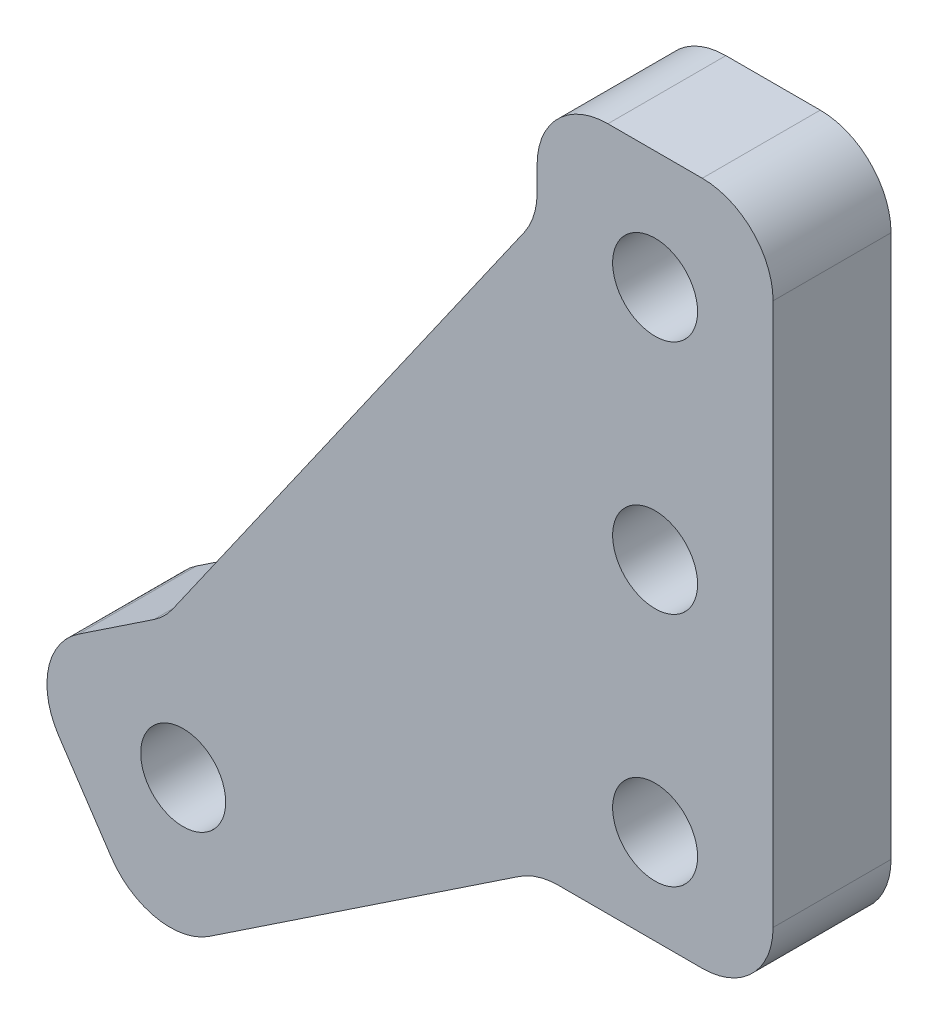
ISO-10303-21;
HEADER;
FILE_DESCRIPTION(('STEP AP214'),'2;1');
FILE_NAME('part.step','',(''),(''),'','','');
FILE_SCHEMA(('AUTOMOTIVE_DESIGN { 1 0 10303 214 1 1 1 1 }'));
ENDSEC;
DATA;
#1=APPLICATION_CONTEXT('core data for automotive mechanical design processes');
#2=APPLICATION_PROTOCOL_DEFINITION('international standard','automotive_design',2000,#1);
#3=PRODUCT_CONTEXT('',#1,'mechanical');
#4=PRODUCT('Part','Part','',(#3));
#5=PRODUCT_RELATED_PRODUCT_CATEGORY('part','',(#4));
#6=PRODUCT_DEFINITION_FORMATION('','',#4);
#7=PRODUCT_DEFINITION_CONTEXT('part definition',#1,'design');
#8=PRODUCT_DEFINITION('design','',#6,#7);
#9=PRODUCT_DEFINITION_SHAPE('','',#8);
#10=(LENGTH_UNIT() NAMED_UNIT(*) SI_UNIT(.MILLI.,.METRE.));
#11=(NAMED_UNIT(*) PLANE_ANGLE_UNIT() SI_UNIT($,.RADIAN.));
#12=(NAMED_UNIT(*) SI_UNIT($,.STERADIAN.) SOLID_ANGLE_UNIT());
#13=UNCERTAINTY_MEASURE_WITH_UNIT(LENGTH_MEASURE(1.E-05),#10,'distance_accuracy_value','');
#14=(GEOMETRIC_REPRESENTATION_CONTEXT(3) GLOBAL_UNCERTAINTY_ASSIGNED_CONTEXT((#13)) GLOBAL_UNIT_ASSIGNED_CONTEXT((#10,
#11,#12)) REPRESENTATION_CONTEXT('',''));
#15=CARTESIAN_POINT('',(0.,0.,0.));
#16=DIRECTION('',(0.,0.,1.));
#17=DIRECTION('',(1.,0.,0.));
#18=AXIS2_PLACEMENT_3D('',#15,#16,#17);
#19=CARTESIAN_POINT('',(0.,0.,6.35));
#20=DIRECTION('',(0.,0.,1.));
#21=DIRECTION('',(1.,0.,0.));
#22=AXIS2_PLACEMENT_3D('',#19,#20,#21);
#23=PLANE('',#22);
#24=CARTESIAN_POINT('',(-25.4,-10.16,6.35));
#25=DIRECTION('',(0.,0.,1.));
#26=DIRECTION('',(1.,0.,0.));
#27=AXIS2_PLACEMENT_3D('',#24,#25,#26);
#28=CIRCLE('',#27,2.286);
#29=CARTESIAN_POINT('',(-23.114,-10.16,6.35));
#30=VERTEX_POINT('',#29);
#31=EDGE_CURVE('E356',#30,#30,#28,.T.);
#32=ORIENTED_EDGE('',*,*,#31,.F.);
#33=EDGE_LOOP('',(#32));
#34=FACE_BOUND('',#33,.T.);
#35=CARTESIAN_POINT('',(0.,0.,6.35));
#36=DIRECTION('',(0.,0.,1.));
#37=DIRECTION('',(1.,0.,0.));
#38=AXIS2_PLACEMENT_3D('',#35,#36,#37);
#39=CIRCLE('',#38,2.286);
#40=CARTESIAN_POINT('',(2.286,0.,6.35));
#41=VERTEX_POINT('',#40);
#42=EDGE_CURVE('E200',#41,#41,#39,.T.);
#43=ORIENTED_EDGE('',*,*,#42,.F.);
#44=EDGE_LOOP('',(#43));
#45=FACE_BOUND('',#44,.T.);
#46=DIRECTION('',(0.,1.,0.));
#47=VECTOR('',#46,1.);
#48=CARTESIAN_POINT('',(6.35,-5.08,6.35));
#49=LINE('',#48,#47);
#50=CARTESIAN_POINT('',(6.35,-1.27,6.35));
#51=VERTEX_POINT('',#50);
#52=CARTESIAN_POINT('',(6.35,27.94,6.35));
#53=VERTEX_POINT('',#52);
#54=EDGE_CURVE('E222',#51,#53,#49,.T.);
#55=ORIENTED_EDGE('',*,*,#54,.T.);
#56=CARTESIAN_POINT('',(2.54,27.94,6.35));
#57=DIRECTION('',(0.,0.,1.));
#58=DIRECTION('',(1.,0.,0.));
#59=AXIS2_PLACEMENT_3D('',#56,#57,#58);
#60=CIRCLE('',#59,3.81);
#61=CARTESIAN_POINT('',(2.54,31.75,6.35));
#62=VERTEX_POINT('',#61);
#63=EDGE_CURVE('E276',#53,#62,#60,.T.);
#64=ORIENTED_EDGE('',*,*,#63,.T.);
#65=DIRECTION('',(-1.,0.,0.));
#66=VECTOR('',#65,1.);
#67=CARTESIAN_POINT('',(6.35,31.75,6.35));
#68=LINE('',#67,#66);
#69=CARTESIAN_POINT('',(-2.54,31.75,6.35));
#70=VERTEX_POINT('',#69);
#71=EDGE_CURVE('E218',#62,#70,#68,.T.);
#72=ORIENTED_EDGE('',*,*,#71,.T.);
#73=CARTESIAN_POINT('',(-2.54,27.94,6.35));
#74=DIRECTION('',(0.,0.,1.));
#75=DIRECTION('',(1.,0.,0.));
#76=AXIS2_PLACEMENT_3D('',#73,#74,#75);
#77=CIRCLE('',#76,3.81);
#78=CARTESIAN_POINT('',(-6.35,27.94,6.35));
#79=VERTEX_POINT('',#78);
#80=EDGE_CURVE('E273',#70,#79,#77,.T.);
#81=ORIENTED_EDGE('',*,*,#80,.T.);
#82=DIRECTION('',(0.,-1.,0.));
#83=VECTOR('',#82,1.);
#84=CARTESIAN_POINT('',(-6.35,31.75,6.35));
#85=LINE('',#84,#83);
#86=CARTESIAN_POINT('',(-6.35,26.6301222656347,6.35));
#87=VERTEX_POINT('',#86);
#88=EDGE_CURVE('E181',#79,#87,#85,.T.);
#89=ORIENTED_EDGE('',*,*,#88,.T.);
#90=CARTESIAN_POINT('',(-10.16,26.6301222656347,6.35));
#91=DIRECTION('',(0.,0.,1.));
#92=DIRECTION('',(1.,0.,0.));
#93=AXIS2_PLACEMENT_3D('',#90,#91,#92);
#94=CIRCLE('',#93,3.81);
#95=CARTESIAN_POINT('',(-7.03903071125895,24.4447960431372,6.35));
#96=VERTEX_POINT('',#95);
#97=EDGE_CURVE('E299',#87,#96,#94,.F.);
#98=ORIENTED_EDGE('',*,*,#97,.T.);
#99=DIRECTION('',(0.57357643635105,0.819152044288989,0.));
#100=VECTOR('',#99,1.);
#101=CARTESIAN_POINT('',(-26.3835326284189,-3.18201581127342,6.35));
#102=LINE('',#101,#100);
#103=CARTESIAN_POINT('',(-25.972982163399,-2.59568898298822,6.35));
#104=VERTEX_POINT('',#103);
#105=EDGE_CURVE('E184',#96,#104,#102,.F.);
#106=ORIENTED_EDGE('',*,*,#105,.T.);
#107=CARTESIAN_POINT('',(-29.09395145214,-0.410362760490718,6.35));
#108=DIRECTION('',(0.,0.,1.));
#109=DIRECTION('',(1.,0.,0.));
#110=AXIS2_PLACEMENT_3D('',#107,#108,#109);
#111=CIRCLE('',#110,3.81);
#112=CARTESIAN_POINT('',(-26.978883642679,-3.57936704596935,6.35));
#113=VERTEX_POINT('',#112);
#114=EDGE_CURVE('E307',#104,#113,#111,.F.);
#115=ORIENTED_EDGE('',*,*,#114,.T.);
#116=DIRECTION('',(-0.83175965498127,-0.555135907995005,0.));
#117=VECTOR('',#116,1.);
#118=CARTESIAN_POINT('',(-6.35,10.1888338800059,6.35));
#119=LINE('',#118,#117);
#120=CARTESIAN_POINT('',(-31.0377825394207,-6.28837139717625,6.35));
#121=VERTEX_POINT('',#120);
#122=EDGE_CURVE('E335',#113,#121,#119,.T.);
#123=ORIENTED_EDGE('',*,*,#122,.T.);
#124=CARTESIAN_POINT('',(-28.9227147299597,-9.45737568265489,6.35));
#125=DIRECTION('',(0.,0.,1.));
#126=DIRECTION('',(1.,0.,0.));
#127=AXIS2_PLACEMENT_3D('',#124,#125,#126);
#128=CIRCLE('',#127,3.81);
#129=CARTESIAN_POINT('',(-32.0917190154384,-11.5724434921159,6.35));
#130=VERTEX_POINT('',#129);
#131=EDGE_CURVE('E270',#121,#130,#128,.T.);
#132=ORIENTED_EDGE('',*,*,#131,.T.);
#133=DIRECTION('',(0.555135907995005,-0.83175965498127,0.));
#134=VECTOR('',#133,1.);
#135=CARTESIAN_POINT('',(-34.2067868248993,-8.40343920663722,6.35));
#136=LINE('',#135,#134);
#137=CARTESIAN_POINT('',(-29.2716286028237,-15.7977825394207,6.35));
#138=VERTEX_POINT('',#137);
#139=EDGE_CURVE('E329',#130,#138,#136,.T.);
#140=ORIENTED_EDGE('',*,*,#139,.T.);
#141=CARTESIAN_POINT('',(-26.1026243173451,-13.6827147299597,6.35));
#142=DIRECTION('',(0.,0.,1.));
#143=DIRECTION('',(1.,0.,0.));
#144=AXIS2_PLACEMENT_3D('',#141,#142,#143);
#145=CIRCLE('',#144,3.81);
#146=CARTESIAN_POINT('',(-23.9875565078841,-16.8517190154384,6.35));
#147=VERTEX_POINT('',#146);
#148=EDGE_CURVE('E264',#138,#147,#145,.T.);
#149=ORIENTED_EDGE('',*,*,#148,.T.);
#150=DIRECTION('',(0.83175965498127,0.555135907995005,0.));
#151=VECTOR('',#150,1.);
#152=CARTESIAN_POINT('',(-6.35,-5.08,6.35));
#153=LINE('',#152,#151);
#154=CARTESIAN_POINT('',(-7.31040332948442,-5.72099571452136,6.35));
#155=VERTEX_POINT('',#154);
#156=EDGE_CURVE('E324',#147,#155,#153,.T.);
#157=ORIENTED_EDGE('',*,*,#156,.T.);
#158=CARTESIAN_POINT('',(-5.19533552002345,-8.89,6.35));
#159=DIRECTION('',(0.,0.,1.));
#160=DIRECTION('',(1.,0.,0.));
#161=AXIS2_PLACEMENT_3D('',#158,#159,#160);
#162=CIRCLE('',#161,3.81);
#163=CARTESIAN_POINT('',(-5.19533552002345,-5.08,6.35));
#164=VERTEX_POINT('',#163);
#165=EDGE_CURVE('E11',#155,#164,#162,.F.);
#166=ORIENTED_EDGE('',*,*,#165,.T.);
#167=DIRECTION('',(1.,0.,0.));
#168=VECTOR('',#167,1.);
#169=CARTESIAN_POINT('',(6.35,-5.08,6.35));
#170=LINE('',#169,#168);
#171=CARTESIAN_POINT('',(2.54,-5.08,6.35));
#172=VERTEX_POINT('',#171);
#173=EDGE_CURVE('E321',#164,#172,#170,.T.);
#174=ORIENTED_EDGE('',*,*,#173,.T.);
#175=CARTESIAN_POINT('',(2.54,-1.27,6.35));
#176=DIRECTION('',(0.,0.,1.));
#177=DIRECTION('',(1.,0.,0.));
#178=AXIS2_PLACEMENT_3D('',#175,#176,#177);
#179=CIRCLE('',#178,3.81);
#180=EDGE_CURVE('E267',#172,#51,#179,.T.);
#181=ORIENTED_EDGE('',*,*,#180,.T.);
#182=EDGE_LOOP('',(#55,#64,#72,#81,#89,#98,#106,#115,#123,#132,#140,#149,#157,#166,#174,#181));
#183=FACE_BOUND('',#182,.T.);
#184=CARTESIAN_POINT('',(0.,25.4,6.35));
#185=DIRECTION('',(0.,0.,1.));
#186=DIRECTION('',(1.,0.,0.));
#187=AXIS2_PLACEMENT_3D('',#184,#185,#186);
#188=CIRCLE('',#187,2.286);
#189=CARTESIAN_POINT('',(2.286,25.4,6.35));
#190=VERTEX_POINT('',#189);
#191=EDGE_CURVE('E348',#190,#190,#188,.T.);
#192=ORIENTED_EDGE('',*,*,#191,.F.);
#193=EDGE_LOOP('',(#192));
#194=FACE_BOUND('',#193,.T.);
#195=CARTESIAN_POINT('',(0.,12.7,6.35));
#196=DIRECTION('',(0.,0.,1.));
#197=DIRECTION('',(1.,0.,0.));
#198=AXIS2_PLACEMENT_3D('',#195,#196,#197);
#199=CIRCLE('',#198,2.286);
#200=CARTESIAN_POINT('',(2.286,12.7,6.35));
#201=VERTEX_POINT('',#200);
#202=EDGE_CURVE('E364',#201,#201,#199,.T.);
#203=ORIENTED_EDGE('',*,*,#202,.F.);
#204=EDGE_LOOP('',(#203));
#205=FACE_BOUND('',#204,.T.);
#206=ADVANCED_FACE('F45',(#34,#45,#183,#194,#205),#23,.T.);
#207=CARTESIAN_POINT('',(0.,0.,0.));
#208=DIRECTION('',(0.,0.,1.));
#209=DIRECTION('',(1.,0.,0.));
#210=AXIS2_PLACEMENT_3D('',#207,#208,#209);
#211=PLANE('',#210);
#212=DIRECTION('',(-1.,0.,0.));
#213=VECTOR('',#212,1.);
#214=CARTESIAN_POINT('',(6.35,31.75,0.));
#215=LINE('',#214,#213);
#216=CARTESIAN_POINT('',(2.54,31.75,0.));
#217=VERTEX_POINT('',#216);
#218=CARTESIAN_POINT('',(-2.54,31.75,0.));
#219=VERTEX_POINT('',#218);
#220=EDGE_CURVE('E193',#217,#219,#215,.T.);
#221=ORIENTED_EDGE('',*,*,#220,.F.);
#222=CARTESIAN_POINT('',(2.54,27.94,0.));
#223=DIRECTION('',(0.,0.,1.));
#224=DIRECTION('',(1.,0.,0.));
#225=AXIS2_PLACEMENT_3D('',#222,#223,#224);
#226=CIRCLE('',#225,3.81);
#227=CARTESIAN_POINT('',(6.35,27.94,0.));
#228=VERTEX_POINT('',#227);
#229=EDGE_CURVE('E170',#217,#228,#226,.F.);
#230=ORIENTED_EDGE('',*,*,#229,.T.);
#231=DIRECTION('',(0.,1.,0.));
#232=VECTOR('',#231,1.);
#233=CARTESIAN_POINT('',(6.35,-5.08,0.));
#234=LINE('',#233,#232);
#235=CARTESIAN_POINT('',(6.35,-1.27,0.));
#236=VERTEX_POINT('',#235);
#237=EDGE_CURVE('E214',#236,#228,#234,.T.);
#238=ORIENTED_EDGE('',*,*,#237,.F.);
#239=CARTESIAN_POINT('',(2.54,-1.27,0.));
#240=DIRECTION('',(0.,0.,1.));
#241=DIRECTION('',(1.,0.,0.));
#242=AXIS2_PLACEMENT_3D('',#239,#240,#241);
#243=CIRCLE('',#242,3.81);
#244=CARTESIAN_POINT('',(2.54,-5.08,0.));
#245=VERTEX_POINT('',#244);
#246=EDGE_CURVE('E250',#236,#245,#243,.F.);
#247=ORIENTED_EDGE('',*,*,#246,.T.);
#248=DIRECTION('',(1.,0.,0.));
#249=VECTOR('',#248,1.);
#250=CARTESIAN_POINT('',(6.35,-5.08,0.));
#251=LINE('',#250,#249);
#252=CARTESIAN_POINT('',(-5.19533552002345,-5.08,0.));
#253=VERTEX_POINT('',#252);
#254=EDGE_CURVE('E211',#253,#245,#251,.T.);
#255=ORIENTED_EDGE('',*,*,#254,.F.);
#256=CARTESIAN_POINT('',(-5.19533552002345,-8.89,0.));
#257=DIRECTION('',(0.,0.,1.));
#258=DIRECTION('',(1.,0.,0.));
#259=AXIS2_PLACEMENT_3D('',#256,#257,#258);
#260=CIRCLE('',#259,3.81);
#261=CARTESIAN_POINT('',(-7.31040332948442,-5.72099571452136,0.));
#262=VERTEX_POINT('',#261);
#263=EDGE_CURVE('E54',#253,#262,#260,.T.);
#264=ORIENTED_EDGE('',*,*,#263,.T.);
#265=DIRECTION('',(0.83175965498127,0.555135907995005,0.));
#266=VECTOR('',#265,1.);
#267=CARTESIAN_POINT('',(-6.35,-5.08,0.));
#268=LINE('',#267,#266);
#269=CARTESIAN_POINT('',(-23.9875565078841,-16.8517190154384,0.));
#270=VERTEX_POINT('',#269);
#271=EDGE_CURVE('E207',#270,#262,#268,.T.);
#272=ORIENTED_EDGE('',*,*,#271,.F.);
#273=CARTESIAN_POINT('',(-26.1026243173451,-13.6827147299597,0.));
#274=DIRECTION('',(0.,0.,1.));
#275=DIRECTION('',(1.,0.,0.));
#276=AXIS2_PLACEMENT_3D('',#273,#274,#275);
#277=CIRCLE('',#276,3.81);
#278=CARTESIAN_POINT('',(-29.2716286028237,-15.7977825394207,0.));
#279=VERTEX_POINT('',#278);
#280=EDGE_CURVE('E247',#270,#279,#277,.F.);
#281=ORIENTED_EDGE('',*,*,#280,.T.);
#282=DIRECTION('',(0.555135907995005,-0.83175965498127,0.));
#283=VECTOR('',#282,1.);
#284=CARTESIAN_POINT('',(-34.2067868248993,-8.40343920663722,0.));
#285=LINE('',#284,#283);
#286=CARTESIAN_POINT('',(-32.0917190154384,-11.5724434921159,0.));
#287=VERTEX_POINT('',#286);
#288=EDGE_CURVE('E198',#287,#279,#285,.T.);
#289=ORIENTED_EDGE('',*,*,#288,.F.);
#290=CARTESIAN_POINT('',(-28.9227147299597,-9.45737568265489,0.));
#291=DIRECTION('',(0.,0.,1.));
#292=DIRECTION('',(1.,0.,0.));
#293=AXIS2_PLACEMENT_3D('',#290,#291,#292);
#294=CIRCLE('',#293,3.81);
#295=CARTESIAN_POINT('',(-31.0377825394207,-6.28837139717625,0.));
#296=VERTEX_POINT('',#295);
#297=EDGE_CURVE('E171',#287,#296,#294,.F.);
#298=ORIENTED_EDGE('',*,*,#297,.T.);
#299=DIRECTION('',(-0.83175965498127,-0.555135907995005,0.));
#300=VECTOR('',#299,1.);
#301=CARTESIAN_POINT('',(-6.35,10.1888338800059,0.));
#302=LINE('',#301,#300);
#303=CARTESIAN_POINT('',(-26.978883642679,-3.57936704596935,0.));
#304=VERTEX_POINT('',#303);
#305=EDGE_CURVE('E192',#304,#296,#302,.T.);
#306=ORIENTED_EDGE('',*,*,#305,.F.);
#307=CARTESIAN_POINT('',(-29.09395145214,-0.410362760490718,0.));
#308=DIRECTION('',(0.,0.,1.));
#309=DIRECTION('',(1.,0.,0.));
#310=AXIS2_PLACEMENT_3D('',#307,#308,#309);
#311=CIRCLE('',#310,3.81);
#312=CARTESIAN_POINT('',(-25.972982163399,-2.59568898298822,0.));
#313=VERTEX_POINT('',#312);
#314=EDGE_CURVE('E304',#304,#313,#311,.T.);
#315=ORIENTED_EDGE('',*,*,#314,.T.);
#316=DIRECTION('',(-0.57357643635105,-0.819152044288989,0.));
#317=VECTOR('',#316,1.);
#318=CARTESIAN_POINT('',(-16.2085577311751,11.3493543068762,0.));
#319=LINE('',#318,#317);
#320=CARTESIAN_POINT('',(-7.03903071125895,24.4447960431372,0.));
#321=VERTEX_POINT('',#320);
#322=EDGE_CURVE('E219',#313,#321,#319,.F.);
#323=ORIENTED_EDGE('',*,*,#322,.T.);
#324=CARTESIAN_POINT('',(-10.16,26.6301222656347,0.));
#325=DIRECTION('',(0.,0.,1.));
#326=DIRECTION('',(1.,0.,0.));
#327=AXIS2_PLACEMENT_3D('',#324,#325,#326);
#328=CIRCLE('',#327,3.81);
#329=CARTESIAN_POINT('',(-6.35,26.6301222656347,0.));
#330=VERTEX_POINT('',#329);
#331=EDGE_CURVE('E190',#321,#330,#328,.T.);
#332=ORIENTED_EDGE('',*,*,#331,.T.);
#333=DIRECTION('',(0.,-1.,0.));
#334=VECTOR('',#333,1.);
#335=CARTESIAN_POINT('',(-6.35,31.75,0.));
#336=LINE('',#335,#334);
#337=CARTESIAN_POINT('',(-6.35,27.94,0.));
#338=VERTEX_POINT('',#337);
#339=EDGE_CURVE('E178',#338,#330,#336,.T.);
#340=ORIENTED_EDGE('',*,*,#339,.F.);
#341=CARTESIAN_POINT('',(-2.54,27.94,0.));
#342=DIRECTION('',(0.,0.,1.));
#343=DIRECTION('',(1.,0.,0.));
#344=AXIS2_PLACEMENT_3D('',#341,#342,#343);
#345=CIRCLE('',#344,3.81);
#346=EDGE_CURVE('E159',#338,#219,#345,.F.);
#347=ORIENTED_EDGE('',*,*,#346,.T.);
#348=EDGE_LOOP('',(#221,#230,#238,#247,#255,#264,#272,#281,#289,#298,#306,#315,#323,#332,#340,#347));
#349=FACE_BOUND('',#348,.T.);
#350=CARTESIAN_POINT('',(0.,0.,0.));
#351=DIRECTION('',(0.,0.,1.));
#352=DIRECTION('',(1.,0.,0.));
#353=AXIS2_PLACEMENT_3D('',#350,#351,#352);
#354=CIRCLE('',#353,2.286);
#355=CARTESIAN_POINT('',(2.286,0.,0.));
#356=VERTEX_POINT('',#355);
#357=EDGE_CURVE('E344',#356,#356,#354,.T.);
#358=ORIENTED_EDGE('',*,*,#357,.T.);
#359=EDGE_LOOP('',(#358));
#360=FACE_BOUND('',#359,.T.);
#361=CARTESIAN_POINT('',(0.,25.4,0.));
#362=DIRECTION('',(0.,0.,1.));
#363=DIRECTION('',(1.,0.,0.));
#364=AXIS2_PLACEMENT_3D('',#361,#362,#363);
#365=CIRCLE('',#364,2.286);
#366=CARTESIAN_POINT('',(2.286,25.4,0.));
#367=VERTEX_POINT('',#366);
#368=EDGE_CURVE('E352',#367,#367,#365,.T.);
#369=ORIENTED_EDGE('',*,*,#368,.T.);
#370=EDGE_LOOP('',(#369));
#371=FACE_BOUND('',#370,.T.);
#372=CARTESIAN_POINT('',(-25.4,-10.16,0.));
#373=DIRECTION('',(0.,0.,1.));
#374=DIRECTION('',(1.,0.,0.));
#375=AXIS2_PLACEMENT_3D('',#372,#373,#374);
#376=CIRCLE('',#375,2.286);
#377=CARTESIAN_POINT('',(-23.114,-10.16,0.));
#378=VERTEX_POINT('',#377);
#379=EDGE_CURVE('E360',#378,#378,#376,.T.);
#380=ORIENTED_EDGE('',*,*,#379,.T.);
#381=EDGE_LOOP('',(#380));
#382=FACE_BOUND('',#381,.T.);
#383=CARTESIAN_POINT('',(0.,12.7,0.));
#384=DIRECTION('',(0.,0.,1.));
#385=DIRECTION('',(1.,0.,0.));
#386=AXIS2_PLACEMENT_3D('',#383,#384,#385);
#387=CIRCLE('',#386,2.286);
#388=CARTESIAN_POINT('',(2.286,12.7,0.));
#389=VERTEX_POINT('',#388);
#390=EDGE_CURVE('E368',#389,#389,#387,.T.);
#391=ORIENTED_EDGE('',*,*,#390,.T.);
#392=EDGE_LOOP('',(#391));
#393=FACE_BOUND('',#392,.T.);
#394=ADVANCED_FACE('F186',(#349,#360,#371,#382,#393),#211,.F.);
#395=CARTESIAN_POINT('',(6.35,31.75,6.35));
#396=DIRECTION('',(0.,-1.,0.));
#397=DIRECTION('',(0.,0.,-1.));
#398=AXIS2_PLACEMENT_3D('',#395,#396,#397);
#399=PLANE('',#398);
#400=ORIENTED_EDGE('',*,*,#71,.F.);
#401=DIRECTION('',(0.,0.,-1.));
#402=VECTOR('',#401,1.);
#403=CARTESIAN_POINT('',(2.54,31.75,6.35));
#404=LINE('',#403,#402);
#405=EDGE_CURVE('E243',#62,#217,#404,.T.);
#406=ORIENTED_EDGE('',*,*,#405,.T.);
#407=ORIENTED_EDGE('',*,*,#220,.T.);
#408=DIRECTION('',(0.,0.,-1.));
#409=VECTOR('',#408,1.);
#410=CARTESIAN_POINT('',(-2.54,31.75,6.35));
#411=LINE('',#410,#409);
#412=EDGE_CURVE('E164',#219,#70,#411,.F.);
#413=ORIENTED_EDGE('',*,*,#412,.T.);
#414=EDGE_LOOP('',(#400,#406,#407,#413));
#415=FACE_BOUND('',#414,.T.);
#416=ADVANCED_FACE('F385',(#415),#399,.F.);
#417=CARTESIAN_POINT('',(-6.35,31.75,6.35));
#418=DIRECTION('',(1.,0.,0.));
#419=DIRECTION('',(0.,1.,0.));
#420=AXIS2_PLACEMENT_3D('',#417,#418,#419);
#421=PLANE('',#420);
#422=ORIENTED_EDGE('',*,*,#339,.T.);
#423=DIRECTION('',(0.,0.,-1.));
#424=VECTOR('',#423,1.);
#425=CARTESIAN_POINT('',(-6.35,26.6301222656347,6.35));
#426=LINE('',#425,#424);
#427=EDGE_CURVE('E183',#330,#87,#426,.F.);
#428=ORIENTED_EDGE('',*,*,#427,.T.);
#429=ORIENTED_EDGE('',*,*,#88,.F.);
#430=DIRECTION('',(0.,0.,-1.));
#431=VECTOR('',#430,1.);
#432=CARTESIAN_POINT('',(-6.35,27.94,6.35));
#433=LINE('',#432,#431);
#434=EDGE_CURVE('E163',#79,#338,#433,.T.);
#435=ORIENTED_EDGE('',*,*,#434,.T.);
#436=EDGE_LOOP('',(#422,#428,#429,#435));
#437=FACE_BOUND('',#436,.T.);
#438=ADVANCED_FACE('F176',(#437),#421,.F.);
#439=CARTESIAN_POINT('',(-6.35,10.1888338800059,6.35));
#440=DIRECTION('',(0.555135907995005,-0.83175965498127,0.));
#441=DIRECTION('',(0.83175965498127,0.555135907995005,0.));
#442=AXIS2_PLACEMENT_3D('',#439,#440,#441);
#443=PLANE('',#442);
#444=ORIENTED_EDGE('',*,*,#122,.F.);
#445=DIRECTION('',(0.,0.,1.));
#446=VECTOR('',#445,1.);
#447=CARTESIAN_POINT('',(-26.978883642679,-3.57936704596936,0.));
#448=LINE('',#447,#446);
#449=EDGE_CURVE('E237',#113,#304,#448,.F.);
#450=ORIENTED_EDGE('',*,*,#449,.T.);
#451=ORIENTED_EDGE('',*,*,#305,.T.);
#452=DIRECTION('',(0.,0.,-1.));
#453=VECTOR('',#452,1.);
#454=CARTESIAN_POINT('',(-31.0377825394207,-6.28837139717625,6.35));
#455=LINE('',#454,#453);
#456=EDGE_CURVE('E234',#296,#121,#455,.F.);
#457=ORIENTED_EDGE('',*,*,#456,.T.);
#458=EDGE_LOOP('',(#444,#450,#451,#457));
#459=FACE_BOUND('',#458,.T.);
#460=ADVANCED_FACE('F404',(#459),#443,.F.);
#461=CARTESIAN_POINT('',(-34.2067868248993,-8.40343920663722,6.35));
#462=DIRECTION('',(0.83175965498127,0.555135907995005,0.));
#463=DIRECTION('',(-0.555135907995005,0.83175965498127,0.));
#464=AXIS2_PLACEMENT_3D('',#461,#462,#463);
#465=PLANE('',#464);
#466=ORIENTED_EDGE('',*,*,#139,.F.);
#467=DIRECTION('',(0.,0.,-1.));
#468=VECTOR('',#467,1.);
#469=CARTESIAN_POINT('',(-32.0917190154384,-11.5724434921159,6.35));
#470=LINE('',#469,#468);
#471=EDGE_CURVE('E282',#130,#287,#470,.T.);
#472=ORIENTED_EDGE('',*,*,#471,.T.);
#473=ORIENTED_EDGE('',*,*,#288,.T.);
#474=DIRECTION('',(0.,0.,-1.));
#475=VECTOR('',#474,1.);
#476=CARTESIAN_POINT('',(-29.2716286028237,-15.7977825394207,6.35));
#477=LINE('',#476,#475);
#478=EDGE_CURVE('E279',#279,#138,#477,.F.);
#479=ORIENTED_EDGE('',*,*,#478,.T.);
#480=EDGE_LOOP('',(#466,#472,#473,#479));
#481=FACE_BOUND('',#480,.T.);
#482=ADVANCED_FACE('F401',(#481),#465,.F.);
#483=CARTESIAN_POINT('',(-6.35,-5.08,6.35));
#484=DIRECTION('',(-0.555135907995005,0.83175965498127,0.));
#485=DIRECTION('',(-0.83175965498127,-0.555135907995005,0.));
#486=AXIS2_PLACEMENT_3D('',#483,#484,#485);
#487=PLANE('',#486);
#488=ORIENTED_EDGE('',*,*,#271,.T.);
#489=DIRECTION('',(0.,0.,-1.));
#490=VECTOR('',#489,1.);
#491=CARTESIAN_POINT('',(-7.31040332948442,-5.72099571452136,6.35));
#492=LINE('',#491,#490);
#493=EDGE_CURVE('E296',#262,#155,#492,.F.);
#494=ORIENTED_EDGE('',*,*,#493,.T.);
#495=ORIENTED_EDGE('',*,*,#156,.F.);
#496=DIRECTION('',(0.,0.,-1.));
#497=VECTOR('',#496,1.);
#498=CARTESIAN_POINT('',(-23.9875565078841,-16.8517190154384,6.35));
#499=LINE('',#498,#497);
#500=EDGE_CURVE('E292',#147,#270,#499,.T.);
#501=ORIENTED_EDGE('',*,*,#500,.T.);
#502=EDGE_LOOP('',(#488,#494,#495,#501));
#503=FACE_BOUND('',#502,.T.);
#504=ADVANCED_FACE('F316',(#503),#487,.F.);
#505=CARTESIAN_POINT('',(6.35,-5.08,6.35));
#506=DIRECTION('',(0.,1.,0.));
#507=DIRECTION('',(-1.,0.,0.));
#508=AXIS2_PLACEMENT_3D('',#505,#506,#507);
#509=PLANE('',#508);
#510=ORIENTED_EDGE('',*,*,#254,.T.);
#511=DIRECTION('',(0.,0.,-1.));
#512=VECTOR('',#511,1.);
#513=CARTESIAN_POINT('',(2.54,-5.08,6.35));
#514=LINE('',#513,#512);
#515=EDGE_CURVE('E61',#245,#172,#514,.F.);
#516=ORIENTED_EDGE('',*,*,#515,.T.);
#517=ORIENTED_EDGE('',*,*,#173,.F.);
#518=DIRECTION('',(0.,0.,-1.));
#519=VECTOR('',#518,1.);
#520=CARTESIAN_POINT('',(-5.19533552002345,-5.08,0.));
#521=LINE('',#520,#519);
#522=EDGE_CURVE('E286',#164,#253,#521,.T.);
#523=ORIENTED_EDGE('',*,*,#522,.T.);
#524=EDGE_LOOP('',(#510,#516,#517,#523));
#525=FACE_BOUND('',#524,.T.);
#526=ADVANCED_FACE('F320',(#525),#509,.F.);
#527=CARTESIAN_POINT('',(6.35,-5.08,6.35));
#528=DIRECTION('',(-1.,0.,0.));
#529=DIRECTION('',(0.,0.,1.));
#530=AXIS2_PLACEMENT_3D('',#527,#528,#529);
#531=PLANE('',#530);
#532=ORIENTED_EDGE('',*,*,#237,.T.);
#533=DIRECTION('',(0.,0.,-1.));
#534=VECTOR('',#533,1.);
#535=CARTESIAN_POINT('',(6.35,27.94,6.35));
#536=LINE('',#535,#534);
#537=EDGE_CURVE('E261',#228,#53,#536,.F.);
#538=ORIENTED_EDGE('',*,*,#537,.T.);
#539=ORIENTED_EDGE('',*,*,#54,.F.);
#540=DIRECTION('',(0.,0.,-1.));
#541=VECTOR('',#540,1.);
#542=CARTESIAN_POINT('',(6.35,-1.27,6.35));
#543=LINE('',#542,#541);
#544=EDGE_CURVE('E257',#51,#236,#543,.T.);
#545=ORIENTED_EDGE('',*,*,#544,.T.);
#546=EDGE_LOOP('',(#532,#538,#539,#545));
#547=FACE_BOUND('',#546,.T.);
#548=ADVANCED_FACE('F393',(#547),#531,.F.);
#549=CARTESIAN_POINT('',(0.,0.,6.35));
#550=DIRECTION('',(0.,0.,-1.));
#551=DIRECTION('',(-1.,0.,0.));
#552=AXIS2_PLACEMENT_3D('',#549,#550,#551);
#553=CYLINDRICAL_SURFACE('',#552,2.286);
#554=ORIENTED_EDGE('',*,*,#42,.T.);
#555=EDGE_LOOP('',(#554));
#556=FACE_BOUND('',#555,.T.);
#557=ORIENTED_EDGE('',*,*,#357,.F.);
#558=EDGE_LOOP('',(#557));
#559=FACE_BOUND('',#558,.T.);
#560=ADVANCED_FACE('F390',(#556,#559),#553,.F.);
#561=CARTESIAN_POINT('',(0.,25.4,6.35));
#562=DIRECTION('',(0.,0.,-1.));
#563=DIRECTION('',(-1.,0.,0.));
#564=AXIS2_PLACEMENT_3D('',#561,#562,#563);
#565=CYLINDRICAL_SURFACE('',#564,2.286);
#566=ORIENTED_EDGE('',*,*,#191,.T.);
#567=EDGE_LOOP('',(#566));
#568=FACE_BOUND('',#567,.T.);
#569=ORIENTED_EDGE('',*,*,#368,.F.);
#570=EDGE_LOOP('',(#569));
#571=FACE_BOUND('',#570,.T.);
#572=ADVANCED_FACE('F474',(#568,#571),#565,.F.);
#573=CARTESIAN_POINT('',(-25.4,-10.16,6.35));
#574=DIRECTION('',(0.,0.,-1.));
#575=DIRECTION('',(-1.,0.,0.));
#576=AXIS2_PLACEMENT_3D('',#573,#574,#575);
#577=CYLINDRICAL_SURFACE('',#576,2.286);
#578=ORIENTED_EDGE('',*,*,#31,.T.);
#579=EDGE_LOOP('',(#578));
#580=FACE_BOUND('',#579,.T.);
#581=ORIENTED_EDGE('',*,*,#379,.F.);
#582=EDGE_LOOP('',(#581));
#583=FACE_BOUND('',#582,.T.);
#584=ADVANCED_FACE('F477',(#580,#583),#577,.F.);
#585=CARTESIAN_POINT('',(0.,12.7,6.35));
#586=DIRECTION('',(0.,0.,-1.));
#587=DIRECTION('',(-1.,0.,0.));
#588=AXIS2_PLACEMENT_3D('',#585,#586,#587);
#589=CYLINDRICAL_SURFACE('',#588,2.286);
#590=ORIENTED_EDGE('',*,*,#202,.T.);
#591=EDGE_LOOP('',(#590));
#592=FACE_BOUND('',#591,.T.);
#593=ORIENTED_EDGE('',*,*,#390,.F.);
#594=EDGE_LOOP('',(#593));
#595=FACE_BOUND('',#594,.T.);
#596=ADVANCED_FACE('F376',(#592,#595),#589,.F.);
#597=CARTESIAN_POINT('',(-26.3835326284189,-3.18201581127342,6.35));
#598=DIRECTION('',(-0.819152044288989,0.57357643635105,0.));
#599=DIRECTION('',(0.,0.,1.));
#600=AXIS2_PLACEMENT_3D('',#597,#598,#599);
#601=PLANE('',#600);
#602=ORIENTED_EDGE('',*,*,#105,.F.);
#603=DIRECTION('',(0.,0.,1.));
#604=VECTOR('',#603,1.);
#605=CARTESIAN_POINT('',(-7.03903071125895,24.4447960431372,0.));
#606=LINE('',#605,#604);
#607=EDGE_CURVE('E231',#96,#321,#606,.F.);
#608=ORIENTED_EDGE('',*,*,#607,.T.);
#609=ORIENTED_EDGE('',*,*,#322,.F.);
#610=DIRECTION('',(0.,0.,-1.));
#611=VECTOR('',#610,1.);
#612=CARTESIAN_POINT('',(-25.972982163399,-2.59568898298822,6.35));
#613=LINE('',#612,#611);
#614=EDGE_CURVE('E228',#313,#104,#613,.F.);
#615=ORIENTED_EDGE('',*,*,#614,.T.);
#616=EDGE_LOOP('',(#602,#608,#609,#615));
#617=FACE_BOUND('',#616,.T.);
#618=ADVANCED_FACE('F415',(#617),#601,.T.);
#619=CARTESIAN_POINT('',(-10.16,26.6301222656347,6.35));
#620=DIRECTION('',(0.,0.,1.));
#621=DIRECTION('',(1.,0.,0.));
#622=AXIS2_PLACEMENT_3D('',#619,#620,#621);
#623=CYLINDRICAL_SURFACE('',#622,3.81);
#624=ORIENTED_EDGE('',*,*,#331,.F.);
#625=ORIENTED_EDGE('',*,*,#607,.F.);
#626=ORIENTED_EDGE('',*,*,#97,.F.);
#627=ORIENTED_EDGE('',*,*,#427,.F.);
#628=EDGE_LOOP('',(#624,#625,#626,#627));
#629=FACE_BOUND('',#628,.T.);
#630=ADVANCED_FACE('F420',(#629),#623,.F.);
#631=CARTESIAN_POINT('',(-29.09395145214,-0.410362760490718,6.35));
#632=DIRECTION('',(0.,0.,-1.));
#633=DIRECTION('',(-1.,0.,0.));
#634=AXIS2_PLACEMENT_3D('',#631,#632,#633);
#635=CYLINDRICAL_SURFACE('',#634,3.81);
#636=ORIENTED_EDGE('',*,*,#114,.F.);
#637=ORIENTED_EDGE('',*,*,#614,.F.);
#638=ORIENTED_EDGE('',*,*,#314,.F.);
#639=ORIENTED_EDGE('',*,*,#449,.F.);
#640=EDGE_LOOP('',(#636,#637,#638,#639));
#641=FACE_BOUND('',#640,.T.);
#642=ADVANCED_FACE('F424',(#641),#635,.F.);
#643=CARTESIAN_POINT('',(2.54,27.94,6.35));
#644=DIRECTION('',(0.,0.,-1.));
#645=DIRECTION('',(-1.,0.,0.));
#646=AXIS2_PLACEMENT_3D('',#643,#644,#645);
#647=CYLINDRICAL_SURFACE('',#646,3.81);
#648=ORIENTED_EDGE('',*,*,#63,.F.);
#649=ORIENTED_EDGE('',*,*,#537,.F.);
#650=ORIENTED_EDGE('',*,*,#229,.F.);
#651=ORIENTED_EDGE('',*,*,#405,.F.);
#652=EDGE_LOOP('',(#648,#649,#650,#651));
#653=FACE_BOUND('',#652,.T.);
#654=ADVANCED_FACE('F428',(#653),#647,.T.);
#655=CARTESIAN_POINT('',(-2.54,27.94,6.35));
#656=DIRECTION('',(0.,0.,-1.));
#657=DIRECTION('',(-1.,0.,0.));
#658=AXIS2_PLACEMENT_3D('',#655,#656,#657);
#659=CYLINDRICAL_SURFACE('',#658,3.81);
#660=ORIENTED_EDGE('',*,*,#80,.F.);
#661=ORIENTED_EDGE('',*,*,#412,.F.);
#662=ORIENTED_EDGE('',*,*,#346,.F.);
#663=ORIENTED_EDGE('',*,*,#434,.F.);
#664=EDGE_LOOP('',(#660,#661,#662,#663));
#665=FACE_BOUND('',#664,.T.);
#666=ADVANCED_FACE('F162',(#665),#659,.T.);
#667=CARTESIAN_POINT('',(-28.9227147299597,-9.45737568265489,6.35));
#668=DIRECTION('',(0.,0.,-1.));
#669=DIRECTION('',(-1.,0.,0.));
#670=AXIS2_PLACEMENT_3D('',#667,#668,#669);
#671=CYLINDRICAL_SURFACE('',#670,3.81);
#672=ORIENTED_EDGE('',*,*,#131,.F.);
#673=ORIENTED_EDGE('',*,*,#456,.F.);
#674=ORIENTED_EDGE('',*,*,#297,.F.);
#675=ORIENTED_EDGE('',*,*,#471,.F.);
#676=EDGE_LOOP('',(#672,#673,#674,#675));
#677=FACE_BOUND('',#676,.T.);
#678=ADVANCED_FACE('F435',(#677),#671,.T.);
#679=CARTESIAN_POINT('',(2.54,-1.27,6.35));
#680=DIRECTION('',(0.,0.,-1.));
#681=DIRECTION('',(-1.,0.,0.));
#682=AXIS2_PLACEMENT_3D('',#679,#680,#681);
#683=CYLINDRICAL_SURFACE('',#682,3.81);
#684=ORIENTED_EDGE('',*,*,#180,.F.);
#685=ORIENTED_EDGE('',*,*,#515,.F.);
#686=ORIENTED_EDGE('',*,*,#246,.F.);
#687=ORIENTED_EDGE('',*,*,#544,.F.);
#688=EDGE_LOOP('',(#684,#685,#686,#687));
#689=FACE_BOUND('',#688,.T.);
#690=ADVANCED_FACE('F438',(#689),#683,.T.);
#691=CARTESIAN_POINT('',(-5.19533552002345,-8.89,6.35));
#692=DIRECTION('',(0.,0.,1.));
#693=DIRECTION('',(1.,0.,0.));
#694=AXIS2_PLACEMENT_3D('',#691,#692,#693);
#695=CYLINDRICAL_SURFACE('',#694,3.81);
#696=ORIENTED_EDGE('',*,*,#165,.F.);
#697=ORIENTED_EDGE('',*,*,#493,.F.);
#698=ORIENTED_EDGE('',*,*,#263,.F.);
#699=ORIENTED_EDGE('',*,*,#522,.F.);
#700=EDGE_LOOP('',(#696,#697,#698,#699));
#701=FACE_BOUND('',#700,.T.);
#702=ADVANCED_FACE('F319',(#701),#695,.F.);
#703=CARTESIAN_POINT('',(-26.1026243173451,-13.6827147299597,6.35));
#704=DIRECTION('',(0.,0.,-1.));
#705=DIRECTION('',(-1.,0.,0.));
#706=AXIS2_PLACEMENT_3D('',#703,#704,#705);
#707=CYLINDRICAL_SURFACE('',#706,3.81);
#708=ORIENTED_EDGE('',*,*,#148,.F.);
#709=ORIENTED_EDGE('',*,*,#478,.F.);
#710=ORIENTED_EDGE('',*,*,#280,.F.);
#711=ORIENTED_EDGE('',*,*,#500,.F.);
#712=EDGE_LOOP('',(#708,#709,#710,#711));
#713=FACE_BOUND('',#712,.T.);
#714=ADVANCED_FACE('F47',(#713),#707,.T.);
#715=CLOSED_SHELL('',(#206,#394,#416,#438,#460,#482,#504,#526,#548,#560,#572,#584,#596,#618,
#630,#642,#654,#666,#678,#690,#702,#714));
#716=MANIFOLD_SOLID_BREP('B2',#715);
#717=ADVANCED_BREP_SHAPE_REPRESENTATION('',(#18,#716),#14);
#718=SHAPE_DEFINITION_REPRESENTATION(#9,#717);
ENDSEC;
END-ISO-10303-21;
